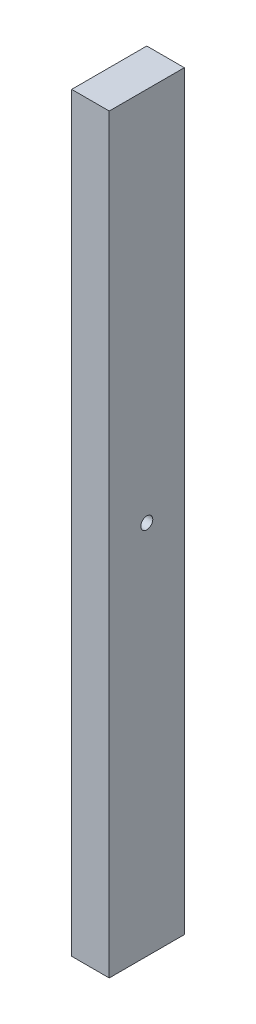
ISO-10303-21;
HEADER;
FILE_DESCRIPTION(('STEP AP214'),'2;1');
FILE_NAME('part.step','',(''),(''),'','','');
FILE_SCHEMA(('AUTOMOTIVE_DESIGN { 1 0 10303 214 1 1 1 1 }'));
ENDSEC;
DATA;
#1=APPLICATION_CONTEXT('core data for automotive mechanical design processes');
#2=APPLICATION_PROTOCOL_DEFINITION('international standard','automotive_design',2000,#1);
#3=PRODUCT_CONTEXT('',#1,'mechanical');
#4=PRODUCT('Part','Part','',(#3));
#5=PRODUCT_RELATED_PRODUCT_CATEGORY('part','',(#4));
#6=PRODUCT_DEFINITION_FORMATION('','',#4);
#7=PRODUCT_DEFINITION_CONTEXT('part definition',#1,'design');
#8=PRODUCT_DEFINITION('design','',#6,#7);
#9=PRODUCT_DEFINITION_SHAPE('','',#8);
#10=(LENGTH_UNIT() NAMED_UNIT(*) SI_UNIT(.MILLI.,.METRE.));
#11=(NAMED_UNIT(*) PLANE_ANGLE_UNIT() SI_UNIT($,.RADIAN.));
#12=(NAMED_UNIT(*) SI_UNIT($,.STERADIAN.) SOLID_ANGLE_UNIT());
#13=UNCERTAINTY_MEASURE_WITH_UNIT(LENGTH_MEASURE(1.E-05),#10,'distance_accuracy_value','');
#14=(GEOMETRIC_REPRESENTATION_CONTEXT(3) GLOBAL_UNCERTAINTY_ASSIGNED_CONTEXT((#13)) GLOBAL_UNIT_ASSIGNED_CONTEXT((#10,
#11,#12)) REPRESENTATION_CONTEXT('',''));
#15=CARTESIAN_POINT('',(0.,0.,0.));
#16=DIRECTION('',(0.,0.,1.));
#17=DIRECTION('',(1.,0.,0.));
#18=AXIS2_PLACEMENT_3D('',#15,#16,#17);
#19=CARTESIAN_POINT('',(-12.5,550.,-25.));
#20=DIRECTION('',(1.,0.,0.));
#21=DIRECTION('',(0.,0.,-1.));
#22=AXIS2_PLACEMENT_3D('',#19,#20,#21);
#23=PLANE('',#22);
#24=CARTESIAN_POINT('',(-12.5,250.,0.));
#25=DIRECTION('',(1.,0.,0.));
#26=DIRECTION('',(0.,0.,-1.));
#27=AXIS2_PLACEMENT_3D('',#24,#25,#26);
#28=CIRCLE('',#27,4.);
#29=CARTESIAN_POINT('',(-12.5,250.,-4.));
#30=VERTEX_POINT('',#29);
#31=EDGE_CURVE('E88',#30,#30,#28,.T.);
#32=ORIENTED_EDGE('',*,*,#31,.T.);
#33=EDGE_LOOP('',(#32));
#34=FACE_BOUND('',#33,.T.);
#35=DIRECTION('',(0.,0.,1.));
#36=VECTOR('',#35,1.);
#37=CARTESIAN_POINT('',(-12.5,500.,-25.));
#38=LINE('',#37,#36);
#39=CARTESIAN_POINT('',(-12.5,500.,-25.));
#40=VERTEX_POINT('',#39);
#41=CARTESIAN_POINT('',(-12.5,500.,25.));
#42=VERTEX_POINT('',#41);
#43=EDGE_CURVE('E83',#40,#42,#38,.T.);
#44=ORIENTED_EDGE('',*,*,#43,.F.);
#45=DIRECTION('',(0.,-1.,0.));
#46=VECTOR('',#45,1.);
#47=CARTESIAN_POINT('',(-12.5,550.,-25.));
#48=LINE('',#47,#46);
#49=CARTESIAN_POINT('',(-12.5,0.,-25.));
#50=VERTEX_POINT('',#49);
#51=EDGE_CURVE('E65',#40,#50,#48,.T.);
#52=ORIENTED_EDGE('',*,*,#51,.T.);
#53=DIRECTION('',(0.,0.,1.));
#54=VECTOR('',#53,1.);
#55=CARTESIAN_POINT('',(-12.5,0.,-25.));
#56=LINE('',#55,#54);
#57=CARTESIAN_POINT('',(-12.5,0.,25.));
#58=VERTEX_POINT('',#57);
#59=EDGE_CURVE('E120',#50,#58,#56,.T.);
#60=ORIENTED_EDGE('',*,*,#59,.T.);
#61=DIRECTION('',(0.,-1.,0.));
#62=VECTOR('',#61,1.);
#63=CARTESIAN_POINT('',(-12.5,550.,25.));
#64=LINE('',#63,#62);
#65=EDGE_CURVE('E11',#42,#58,#64,.T.);
#66=ORIENTED_EDGE('',*,*,#65,.F.);
#67=EDGE_LOOP('',(#44,#52,#60,#66));
#68=FACE_BOUND('',#67,.T.);
#69=ADVANCED_FACE('F42',(#34,#68),#23,.F.);
#70=CARTESIAN_POINT('',(12.5,550.,25.));
#71=DIRECTION('',(0.,0.,-1.));
#72=DIRECTION('',(-1.,0.,0.));
#73=AXIS2_PLACEMENT_3D('',#70,#71,#72);
#74=PLANE('',#73);
#75=DIRECTION('',(1.,0.,0.));
#76=VECTOR('',#75,1.);
#77=CARTESIAN_POINT('',(-12.5,500.,25.));
#78=LINE('',#77,#76);
#79=CARTESIAN_POINT('',(12.5,500.,25.));
#80=VERTEX_POINT('',#79);
#81=EDGE_CURVE('E92',#42,#80,#78,.T.);
#82=ORIENTED_EDGE('',*,*,#81,.F.);
#83=ORIENTED_EDGE('',*,*,#65,.T.);
#84=DIRECTION('',(1.,0.,0.));
#85=VECTOR('',#84,1.);
#86=CARTESIAN_POINT('',(12.5,0.,25.));
#87=LINE('',#86,#85);
#88=CARTESIAN_POINT('',(12.5,0.,25.));
#89=VERTEX_POINT('',#88);
#90=EDGE_CURVE('E116',#58,#89,#87,.T.);
#91=ORIENTED_EDGE('',*,*,#90,.T.);
#92=DIRECTION('',(0.,-1.,0.));
#93=VECTOR('',#92,1.);
#94=CARTESIAN_POINT('',(12.5,550.,25.));
#95=LINE('',#94,#93);
#96=EDGE_CURVE('E50',#80,#89,#95,.T.);
#97=ORIENTED_EDGE('',*,*,#96,.F.);
#98=EDGE_LOOP('',(#82,#83,#91,#97));
#99=FACE_BOUND('',#98,.T.);
#100=ADVANCED_FACE('F117',(#99),#74,.F.);
#101=CARTESIAN_POINT('',(12.5,550.,-25.));
#102=DIRECTION('',(-1.,0.,0.));
#103=DIRECTION('',(0.,0.,1.));
#104=AXIS2_PLACEMENT_3D('',#101,#102,#103);
#105=PLANE('',#104);
#106=CARTESIAN_POINT('',(12.5,250.,0.));
#107=DIRECTION('',(1.,0.,0.));
#108=DIRECTION('',(0.,0.,-1.));
#109=AXIS2_PLACEMENT_3D('',#106,#107,#108);
#110=CIRCLE('',#109,4.);
#111=CARTESIAN_POINT('',(12.5,250.,-4.));
#112=VERTEX_POINT('',#111);
#113=EDGE_CURVE('E142',#112,#112,#110,.T.);
#114=ORIENTED_EDGE('',*,*,#113,.F.);
#115=EDGE_LOOP('',(#114));
#116=FACE_BOUND('',#115,.T.);
#117=DIRECTION('',(0.,0.,-1.));
#118=VECTOR('',#117,1.);
#119=CARTESIAN_POINT('',(12.5,500.,25.));
#120=LINE('',#119,#118);
#121=CARTESIAN_POINT('',(12.5,500.,-25.));
#122=VERTEX_POINT('',#121);
#123=EDGE_CURVE('E57',#80,#122,#120,.T.);
#124=ORIENTED_EDGE('',*,*,#123,.F.);
#125=ORIENTED_EDGE('',*,*,#96,.T.);
#126=DIRECTION('',(0.,0.,-1.));
#127=VECTOR('',#126,1.);
#128=CARTESIAN_POINT('',(12.5,0.,-25.));
#129=LINE('',#128,#127);
#130=CARTESIAN_POINT('',(12.5,0.,-25.));
#131=VERTEX_POINT('',#130);
#132=EDGE_CURVE('E104',#89,#131,#129,.T.);
#133=ORIENTED_EDGE('',*,*,#132,.T.);
#134=DIRECTION('',(0.,-1.,0.));
#135=VECTOR('',#134,1.);
#136=CARTESIAN_POINT('',(12.5,550.,-25.));
#137=LINE('',#136,#135);
#138=EDGE_CURVE('E99',#122,#131,#137,.T.);
#139=ORIENTED_EDGE('',*,*,#138,.F.);
#140=EDGE_LOOP('',(#124,#125,#133,#139));
#141=FACE_BOUND('',#140,.T.);
#142=ADVANCED_FACE('F112',(#116,#141),#105,.F.);
#143=CARTESIAN_POINT('',(12.5,550.,-25.));
#144=DIRECTION('',(0.,0.,1.));
#145=DIRECTION('',(1.,0.,0.));
#146=AXIS2_PLACEMENT_3D('',#143,#144,#145);
#147=PLANE('',#146);
#148=DIRECTION('',(-1.,0.,0.));
#149=VECTOR('',#148,1.);
#150=CARTESIAN_POINT('',(12.5,500.,-25.));
#151=LINE('',#150,#149);
#152=EDGE_CURVE('E81',#122,#40,#151,.T.);
#153=ORIENTED_EDGE('',*,*,#152,.F.);
#154=ORIENTED_EDGE('',*,*,#138,.T.);
#155=DIRECTION('',(-1.,0.,0.));
#156=VECTOR('',#155,1.);
#157=CARTESIAN_POINT('',(12.5,0.,-25.));
#158=LINE('',#157,#156);
#159=EDGE_CURVE('E96',#131,#50,#158,.T.);
#160=ORIENTED_EDGE('',*,*,#159,.T.);
#161=ORIENTED_EDGE('',*,*,#51,.F.);
#162=EDGE_LOOP('',(#153,#154,#160,#161));
#163=FACE_BOUND('',#162,.T.);
#164=ADVANCED_FACE('F94',(#163),#147,.F.);
#165=CARTESIAN_POINT('',(0.,0.,0.));
#166=DIRECTION('',(0.,-1.,0.));
#167=DIRECTION('',(0.,0.,-1.));
#168=AXIS2_PLACEMENT_3D('',#165,#166,#167);
#169=PLANE('',#168);
#170=CARTESIAN_POINT('',(0.,0.,0.));
#171=DIRECTION('',(0.,-1.,0.));
#172=DIRECTION('',(0.,0.,-1.));
#173=AXIS2_PLACEMENT_3D('',#170,#171,#172);
#174=CIRCLE('',#173,4.);
#175=CARTESIAN_POINT('',(0.,0.,-4.));
#176=VERTEX_POINT('',#175);
#177=EDGE_CURVE('E128',#176,#176,#174,.T.);
#178=ORIENTED_EDGE('',*,*,#177,.F.);
#179=EDGE_LOOP('',(#178));
#180=FACE_BOUND('',#179,.T.);
#181=ORIENTED_EDGE('',*,*,#59,.F.);
#182=ORIENTED_EDGE('',*,*,#159,.F.);
#183=ORIENTED_EDGE('',*,*,#132,.F.);
#184=ORIENTED_EDGE('',*,*,#90,.F.);
#185=EDGE_LOOP('',(#181,#182,#183,#184));
#186=FACE_BOUND('',#185,.T.);
#187=ADVANCED_FACE('F122',(#180,#186),#169,.T.);
#188=CARTESIAN_POINT('',(0.,10.,0.));
#189=DIRECTION('',(0.,-1.,0.));
#190=DIRECTION('',(0.,0.,-1.));
#191=AXIS2_PLACEMENT_3D('',#188,#189,#190);
#192=CYLINDRICAL_SURFACE('',#191,4.);
#193=CARTESIAN_POINT('',(0.,10.,0.));
#194=DIRECTION('',(0.,-1.,0.));
#195=DIRECTION('',(0.,0.,-1.));
#196=AXIS2_PLACEMENT_3D('',#193,#194,#195);
#197=CIRCLE('',#196,4.);
#198=CARTESIAN_POINT('',(0.,10.,-4.));
#199=VERTEX_POINT('',#198);
#200=EDGE_CURVE('E127',#199,#199,#197,.T.);
#201=ORIENTED_EDGE('',*,*,#200,.F.);
#202=EDGE_LOOP('',(#201));
#203=FACE_BOUND('',#202,.T.);
#204=ORIENTED_EDGE('',*,*,#177,.T.);
#205=EDGE_LOOP('',(#204));
#206=FACE_BOUND('',#205,.T.);
#207=ADVANCED_FACE('F173',(#203,#206),#192,.F.);
#208=CARTESIAN_POINT('',(0.,10.,0.));
#209=DIRECTION('',(0.,-1.,0.));
#210=DIRECTION('',(0.,0.,-1.));
#211=AXIS2_PLACEMENT_3D('',#208,#209,#210);
#212=PLANE('',#211);
#213=ORIENTED_EDGE('',*,*,#200,.T.);
#214=EDGE_LOOP('',(#213));
#215=FACE_BOUND('',#214,.T.);
#216=ADVANCED_FACE('F168',(#215),#212,.T.);
#217=CARTESIAN_POINT('',(0.,500.,0.));
#218=DIRECTION('',(0.,1.,0.));
#219=DIRECTION('',(0.,0.,1.));
#220=AXIS2_PLACEMENT_3D('',#217,#218,#219);
#221=PLANE('',#220);
#222=ORIENTED_EDGE('',*,*,#152,.T.);
#223=ORIENTED_EDGE('',*,*,#43,.T.);
#224=ORIENTED_EDGE('',*,*,#81,.T.);
#225=ORIENTED_EDGE('',*,*,#123,.T.);
#226=EDGE_LOOP('',(#222,#223,#224,#225));
#227=FACE_BOUND('',#226,.T.);
#228=ADVANCED_FACE('F82',(#227),#221,.T.);
#229=CARTESIAN_POINT('',(-38.5,250.,0.));
#230=DIRECTION('',(1.,0.,0.));
#231=DIRECTION('',(0.,0.,-1.));
#232=AXIS2_PLACEMENT_3D('',#229,#230,#231);
#233=CYLINDRICAL_SURFACE('',#232,4.);
#234=ORIENTED_EDGE('',*,*,#113,.T.);
#235=EDGE_LOOP('',(#234));
#236=FACE_BOUND('',#235,.T.);
#237=ORIENTED_EDGE('',*,*,#31,.F.);
#238=EDGE_LOOP('',(#237));
#239=FACE_BOUND('',#238,.T.);
#240=ADVANCED_FACE('F147',(#236,#239),#233,.F.);
#241=CLOSED_SHELL('',(#69,#100,#142,#164,#187,#207,#216,#228,#240));
#242=MANIFOLD_SOLID_BREP('B2',#241);
#243=ADVANCED_BREP_SHAPE_REPRESENTATION('',(#18,#242),#14);
#244=SHAPE_DEFINITION_REPRESENTATION(#9,#243);
ENDSEC;
END-ISO-10303-21;
